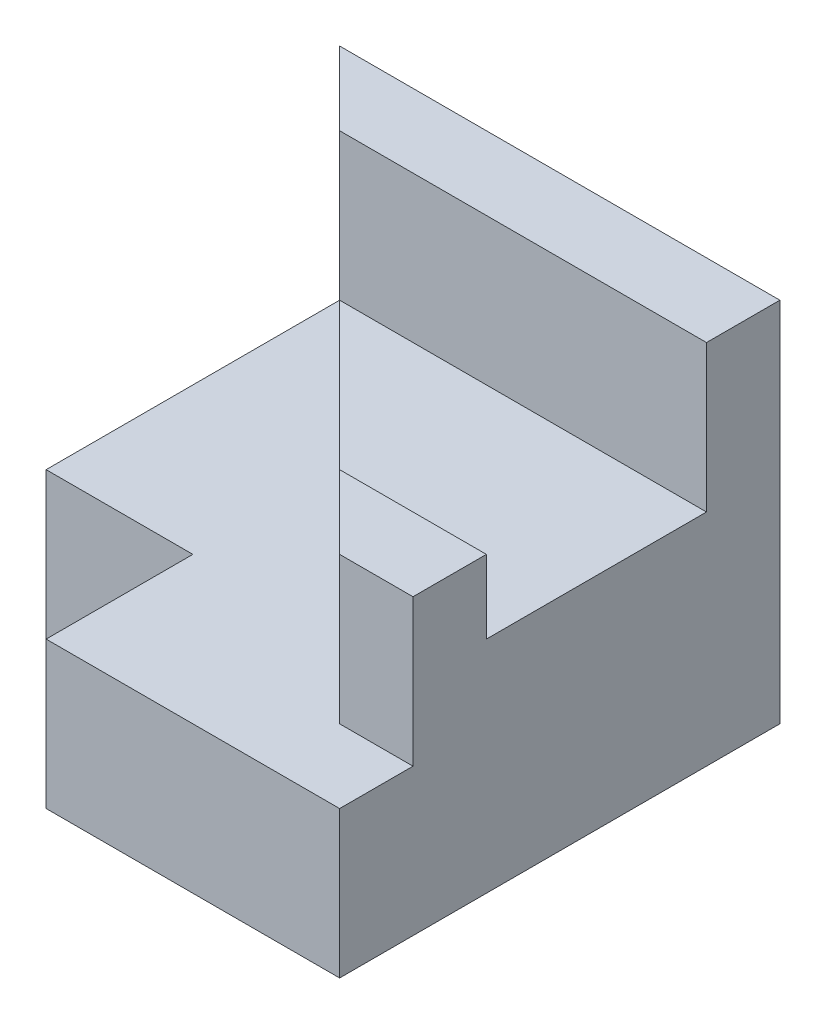
ISO-10303-21;
HEADER;
FILE_DESCRIPTION(('STEP AP214'),'2;1');
FILE_NAME('part.step','',(''),(''),'','','');
FILE_SCHEMA(('AUTOMOTIVE_DESIGN { 1 0 10303 214 1 1 1 1 }'));
ENDSEC;
DATA;
#1=APPLICATION_CONTEXT('core data for automotive mechanical design processes');
#2=APPLICATION_PROTOCOL_DEFINITION('international standard','automotive_design',2000,#1);
#3=PRODUCT_CONTEXT('',#1,'mechanical');
#4=PRODUCT('Part','Part','',(#3));
#5=PRODUCT_RELATED_PRODUCT_CATEGORY('part','',(#4));
#6=PRODUCT_DEFINITION_FORMATION('','',#4);
#7=PRODUCT_DEFINITION_CONTEXT('part definition',#1,'design');
#8=PRODUCT_DEFINITION('design','',#6,#7);
#9=PRODUCT_DEFINITION_SHAPE('','',#8);
#10=(LENGTH_UNIT() NAMED_UNIT(*) SI_UNIT(.MILLI.,.METRE.));
#11=(NAMED_UNIT(*) PLANE_ANGLE_UNIT() SI_UNIT($,.RADIAN.));
#12=(NAMED_UNIT(*) SI_UNIT($,.STERADIAN.) SOLID_ANGLE_UNIT());
#13=UNCERTAINTY_MEASURE_WITH_UNIT(LENGTH_MEASURE(1.E-05),#10,'distance_accuracy_value','');
#14=(GEOMETRIC_REPRESENTATION_CONTEXT(3) GLOBAL_UNCERTAINTY_ASSIGNED_CONTEXT((#13)) GLOBAL_UNIT_ASSIGNED_CONTEXT((#10,
#11,#12)) REPRESENTATION_CONTEXT('',''));
#15=CARTESIAN_POINT('',(0.,0.,0.));
#16=DIRECTION('',(0.,0.,1.));
#17=DIRECTION('',(1.,0.,0.));
#18=AXIS2_PLACEMENT_3D('',#15,#16,#17);
#19=CARTESIAN_POINT('',(0.,-20.,120.));
#20=DIRECTION('',(0.,-1.,0.));
#21=DIRECTION('',(1.,0.,0.));
#22=AXIS2_PLACEMENT_3D('',#19,#20,#21);
#23=PLANE('',#22);
#24=DIRECTION('',(0.707106781186547,0.,0.707106781186548));
#25=VECTOR('',#24,1.);
#26=CARTESIAN_POINT('',(0.,-20.,0.));
#27=LINE('',#26,#25);
#28=CARTESIAN_POINT('',(-120.,-20.,-120.));
#29=VERTEX_POINT('',#28);
#30=CARTESIAN_POINT('',(79.9999999999999,-20.,80.));
#31=VERTEX_POINT('',#30);
#32=EDGE_CURVE('E139',#29,#31,#27,.T.);
#33=ORIENTED_EDGE('',*,*,#32,.F.);
#34=DIRECTION('',(0.,0.,-1.));
#35=VECTOR('',#34,1.);
#36=CARTESIAN_POINT('',(-120.,-20.,40.));
#37=LINE('',#36,#35);
#38=CARTESIAN_POINT('',(-120.,-20.,40.));
#39=VERTEX_POINT('',#38);
#40=EDGE_CURVE('E227',#39,#29,#37,.T.);
#41=ORIENTED_EDGE('',*,*,#40,.F.);
#42=DIRECTION('',(-1.,0.,0.));
#43=VECTOR('',#42,1.);
#44=CARTESIAN_POINT('',(0.,-20.,40.));
#45=LINE('',#44,#43);
#46=CARTESIAN_POINT('',(-40.0000000000001,-20.,40.));
#47=VERTEX_POINT('',#46);
#48=EDGE_CURVE('E201',#47,#39,#45,.T.);
#49=ORIENTED_EDGE('',*,*,#48,.F.);
#50=DIRECTION('',(0.,0.,-1.));
#51=VECTOR('',#50,1.);
#52=CARTESIAN_POINT('',(-40.0000000000001,-20.,120.));
#53=LINE('',#52,#51);
#54=CARTESIAN_POINT('',(-40.0000000000001,-20.,120.));
#55=VERTEX_POINT('',#54);
#56=EDGE_CURVE('E11',#55,#47,#53,.T.);
#57=ORIENTED_EDGE('',*,*,#56,.F.);
#58=DIRECTION('',(-1.,0.,0.));
#59=VECTOR('',#58,1.);
#60=CARTESIAN_POINT('',(0.,-20.,120.));
#61=LINE('',#60,#59);
#62=CARTESIAN_POINT('',(120.,-20.,120.));
#63=VERTEX_POINT('',#62);
#64=EDGE_CURVE('E269',#63,#55,#61,.T.);
#65=ORIENTED_EDGE('',*,*,#64,.F.);
#66=DIRECTION('',(0.,0.,-1.));
#67=VECTOR('',#66,1.);
#68=CARTESIAN_POINT('',(120.,-20.,120.));
#69=LINE('',#68,#67);
#70=CARTESIAN_POINT('',(120.,-20.,80.));
#71=VERTEX_POINT('',#70);
#72=EDGE_CURVE('E207',#63,#71,#69,.T.);
#73=ORIENTED_EDGE('',*,*,#72,.T.);
#74=DIRECTION('',(-1.,0.,0.));
#75=VECTOR('',#74,1.);
#76=CARTESIAN_POINT('',(0.,-20.,80.));
#77=LINE('',#76,#75);
#78=EDGE_CURVE('E39',#71,#31,#77,.T.);
#79=ORIENTED_EDGE('',*,*,#78,.T.);
#80=EDGE_LOOP('',(#33,#41,#49,#57,#65,#73,#79));
#81=FACE_BOUND('',#80,.T.);
#82=ADVANCED_FACE('F36',(#81),#23,.F.);
#83=CARTESIAN_POINT('',(-40.0000000000001,0.,120.));
#84=DIRECTION('',(1.,0.,0.));
#85=DIRECTION('',(0.,1.,0.));
#86=AXIS2_PLACEMENT_3D('',#83,#84,#85);
#87=PLANE('',#86);
#88=ORIENTED_EDGE('',*,*,#56,.T.);
#89=DIRECTION('',(0.,-1.,0.));
#90=VECTOR('',#89,1.);
#91=CARTESIAN_POINT('',(-40.0000000000001,0.,40.));
#92=LINE('',#91,#90);
#93=CARTESIAN_POINT('',(-40.0000000000001,-100.,40.));
#94=VERTEX_POINT('',#93);
#95=EDGE_CURVE('E192',#47,#94,#92,.T.);
#96=ORIENTED_EDGE('',*,*,#95,.T.);
#97=DIRECTION('',(0.,0.,-1.));
#98=VECTOR('',#97,1.);
#99=CARTESIAN_POINT('',(-40.0000000000001,-100.,120.));
#100=LINE('',#99,#98);
#101=CARTESIAN_POINT('',(-40.0000000000001,-100.,120.));
#102=VERTEX_POINT('',#101);
#103=EDGE_CURVE('E45',#102,#94,#100,.T.);
#104=ORIENTED_EDGE('',*,*,#103,.F.);
#105=DIRECTION('',(0.,-1.,0.));
#106=VECTOR('',#105,1.);
#107=CARTESIAN_POINT('',(-40.0000000000001,0.,120.));
#108=LINE('',#107,#106);
#109=EDGE_CURVE('E276',#55,#102,#108,.T.);
#110=ORIENTED_EDGE('',*,*,#109,.F.);
#111=EDGE_LOOP('',(#88,#96,#104,#110));
#112=FACE_BOUND('',#111,.T.);
#113=ADVANCED_FACE('F282',(#112),#87,.F.);
#114=CARTESIAN_POINT('',(0.,-100.,120.));
#115=DIRECTION('',(0.,-1.,0.));
#116=DIRECTION('',(1.,0.,0.));
#117=AXIS2_PLACEMENT_3D('',#114,#115,#116);
#118=PLANE('',#117);
#119=DIRECTION('',(0.,0.,-1.));
#120=VECTOR('',#119,1.);
#121=CARTESIAN_POINT('',(-120.,-100.,40.));
#122=LINE('',#121,#120);
#123=CARTESIAN_POINT('',(-120.,-100.,40.));
#124=VERTEX_POINT('',#123);
#125=CARTESIAN_POINT('',(-120.,-100.,-120.));
#126=VERTEX_POINT('',#125);
#127=EDGE_CURVE('E225',#124,#126,#122,.T.);
#128=ORIENTED_EDGE('',*,*,#127,.T.);
#129=DIRECTION('',(-1.,0.,0.));
#130=VECTOR('',#129,1.);
#131=CARTESIAN_POINT('',(0.,-100.,-120.));
#132=LINE('',#131,#130);
#133=CARTESIAN_POINT('',(120.,-100.,-120.));
#134=VERTEX_POINT('',#133);
#135=EDGE_CURVE('E188',#134,#126,#132,.T.);
#136=ORIENTED_EDGE('',*,*,#135,.F.);
#137=DIRECTION('',(0.,0.,-1.));
#138=VECTOR('',#137,1.);
#139=CARTESIAN_POINT('',(120.,-100.,120.));
#140=LINE('',#139,#138);
#141=CARTESIAN_POINT('',(120.,-100.,120.));
#142=VERTEX_POINT('',#141);
#143=EDGE_CURVE('E210',#142,#134,#140,.T.);
#144=ORIENTED_EDGE('',*,*,#143,.F.);
#145=DIRECTION('',(-1.,0.,0.));
#146=VECTOR('',#145,1.);
#147=CARTESIAN_POINT('',(0.,-100.,120.));
#148=LINE('',#147,#146);
#149=EDGE_CURVE('E274',#142,#102,#148,.T.);
#150=ORIENTED_EDGE('',*,*,#149,.T.);
#151=ORIENTED_EDGE('',*,*,#103,.T.);
#152=DIRECTION('',(-1.,0.,0.));
#153=VECTOR('',#152,1.);
#154=CARTESIAN_POINT('',(0.,-100.,40.));
#155=LINE('',#154,#153);
#156=EDGE_CURVE('E223',#94,#124,#155,.T.);
#157=ORIENTED_EDGE('',*,*,#156,.T.);
#158=EDGE_LOOP('',(#128,#136,#144,#150,#151,#157));
#159=FACE_BOUND('',#158,.T.);
#160=ADVANCED_FACE('F239',(#159),#118,.T.);
#161=CARTESIAN_POINT('',(120.,0.,120.));
#162=DIRECTION('',(1.,0.,0.));
#163=DIRECTION('',(0.,1.,0.));
#164=AXIS2_PLACEMENT_3D('',#161,#162,#163);
#165=PLANE('',#164);
#166=ORIENTED_EDGE('',*,*,#143,.T.);
#167=DIRECTION('',(0.,-1.,0.));
#168=VECTOR('',#167,1.);
#169=CARTESIAN_POINT('',(120.,0.,-120.));
#170=LINE('',#169,#168);
#171=CARTESIAN_POINT('',(120.,100.,-120.));
#172=VERTEX_POINT('',#171);
#173=EDGE_CURVE('E146',#172,#134,#170,.T.);
#174=ORIENTED_EDGE('',*,*,#173,.F.);
#175=DIRECTION('',(0.,0.,-1.));
#176=VECTOR('',#175,1.);
#177=CARTESIAN_POINT('',(120.,100.,0.));
#178=LINE('',#177,#176);
#179=CARTESIAN_POINT('',(120.,100.,-80.));
#180=VERTEX_POINT('',#179);
#181=EDGE_CURVE('E143',#180,#172,#178,.T.);
#182=ORIENTED_EDGE('',*,*,#181,.F.);
#183=DIRECTION('',(0.,-1.,0.));
#184=VECTOR('',#183,1.);
#185=CARTESIAN_POINT('',(120.,100.,-80.));
#186=LINE('',#185,#184);
#187=CARTESIAN_POINT('',(120.,20.,-80.));
#188=VERTEX_POINT('',#187);
#189=EDGE_CURVE('E130',#180,#188,#186,.T.);
#190=ORIENTED_EDGE('',*,*,#189,.T.);
#191=DIRECTION('',(0.,0.,-1.));
#192=VECTOR('',#191,1.);
#193=CARTESIAN_POINT('',(120.,20.,0.));
#194=LINE('',#193,#192);
#195=CARTESIAN_POINT('',(120.,20.,40.));
#196=VERTEX_POINT('',#195);
#197=EDGE_CURVE('E249',#196,#188,#194,.T.);
#198=ORIENTED_EDGE('',*,*,#197,.F.);
#199=DIRECTION('',(0.,-1.,0.));
#200=VECTOR('',#199,1.);
#201=CARTESIAN_POINT('',(120.,60.,40.));
#202=LINE('',#201,#200);
#203=CARTESIAN_POINT('',(120.,60.,40.));
#204=VERTEX_POINT('',#203);
#205=EDGE_CURVE('E53',#204,#196,#202,.T.);
#206=ORIENTED_EDGE('',*,*,#205,.F.);
#207=DIRECTION('',(0.,0.,-1.));
#208=VECTOR('',#207,1.);
#209=CARTESIAN_POINT('',(120.,60.,0.));
#210=LINE('',#209,#208);
#211=CARTESIAN_POINT('',(120.,60.,80.));
#212=VERTEX_POINT('',#211);
#213=EDGE_CURVE('E166',#212,#204,#210,.T.);
#214=ORIENTED_EDGE('',*,*,#213,.F.);
#215=DIRECTION('',(0.,-1.,0.));
#216=VECTOR('',#215,1.);
#217=CARTESIAN_POINT('',(120.,60.,80.));
#218=LINE('',#217,#216);
#219=EDGE_CURVE('E176',#212,#71,#218,.T.);
#220=ORIENTED_EDGE('',*,*,#219,.T.);
#221=ORIENTED_EDGE('',*,*,#72,.F.);
#222=DIRECTION('',(0.,-1.,0.));
#223=VECTOR('',#222,1.);
#224=CARTESIAN_POINT('',(120.,0.,120.));
#225=LINE('',#224,#223);
#226=EDGE_CURVE('E211',#63,#142,#225,.T.);
#227=ORIENTED_EDGE('',*,*,#226,.T.);
#228=EDGE_LOOP('',(#166,#174,#182,#190,#198,#206,#214,#220,#221,#227));
#229=FACE_BOUND('',#228,.T.);
#230=ADVANCED_FACE('F144',(#229),#165,.T.);
#231=CARTESIAN_POINT('',(0.,0.,120.));
#232=DIRECTION('',(0.,0.,1.));
#233=DIRECTION('',(1.,0.,0.));
#234=AXIS2_PLACEMENT_3D('',#231,#232,#233);
#235=PLANE('',#234);
#236=ORIENTED_EDGE('',*,*,#64,.T.);
#237=ORIENTED_EDGE('',*,*,#109,.T.);
#238=ORIENTED_EDGE('',*,*,#149,.F.);
#239=ORIENTED_EDGE('',*,*,#226,.F.);
#240=EDGE_LOOP('',(#236,#237,#238,#239));
#241=FACE_BOUND('',#240,.T.);
#242=ADVANCED_FACE('F283',(#241),#235,.T.);
#243=CARTESIAN_POINT('',(-120.,0.,40.));
#244=DIRECTION('',(1.,0.,0.));
#245=DIRECTION('',(0.,1.,0.));
#246=AXIS2_PLACEMENT_3D('',#243,#244,#245);
#247=PLANE('',#246);
#248=ORIENTED_EDGE('',*,*,#40,.T.);
#249=DIRECTION('',(0.,-1.,0.));
#250=VECTOR('',#249,1.);
#251=CARTESIAN_POINT('',(-120.,0.,-120.));
#252=LINE('',#251,#250);
#253=EDGE_CURVE('E185',#29,#126,#252,.T.);
#254=ORIENTED_EDGE('',*,*,#253,.T.);
#255=ORIENTED_EDGE('',*,*,#127,.F.);
#256=DIRECTION('',(0.,-1.,0.));
#257=VECTOR('',#256,1.);
#258=CARTESIAN_POINT('',(-120.,0.,40.));
#259=LINE('',#258,#257);
#260=EDGE_CURVE('E195',#39,#124,#259,.T.);
#261=ORIENTED_EDGE('',*,*,#260,.F.);
#262=EDGE_LOOP('',(#248,#254,#255,#261));
#263=FACE_BOUND('',#262,.T.);
#264=ADVANCED_FACE('F236',(#263),#247,.F.);
#265=CARTESIAN_POINT('',(0.,0.,40.));
#266=DIRECTION('',(0.,0.,1.));
#267=DIRECTION('',(1.,0.,0.));
#268=AXIS2_PLACEMENT_3D('',#265,#266,#267);
#269=PLANE('',#268);
#270=ORIENTED_EDGE('',*,*,#95,.F.);
#271=ORIENTED_EDGE('',*,*,#48,.T.);
#272=ORIENTED_EDGE('',*,*,#260,.T.);
#273=ORIENTED_EDGE('',*,*,#156,.F.);
#274=EDGE_LOOP('',(#270,#271,#272,#273));
#275=FACE_BOUND('',#274,.T.);
#276=ADVANCED_FACE('F232',(#275),#269,.T.);
#277=CARTESIAN_POINT('',(0.,0.,-120.));
#278=DIRECTION('',(0.,0.,1.));
#279=DIRECTION('',(1.,0.,0.));
#280=AXIS2_PLACEMENT_3D('',#277,#278,#279);
#281=PLANE('',#280);
#282=ORIENTED_EDGE('',*,*,#253,.F.);
#283=DIRECTION('',(0.,-1.,0.));
#284=VECTOR('',#283,1.);
#285=CARTESIAN_POINT('',(-120.,100.,-120.));
#286=LINE('',#285,#284);
#287=CARTESIAN_POINT('',(-120.,100.,-120.));
#288=VERTEX_POINT('',#287);
#289=EDGE_CURVE('E140',#288,#29,#286,.T.);
#290=ORIENTED_EDGE('',*,*,#289,.F.);
#291=DIRECTION('',(-1.,0.,0.));
#292=VECTOR('',#291,1.);
#293=CARTESIAN_POINT('',(0.,100.,-120.));
#294=LINE('',#293,#292);
#295=EDGE_CURVE('E149',#172,#288,#294,.T.);
#296=ORIENTED_EDGE('',*,*,#295,.F.);
#297=ORIENTED_EDGE('',*,*,#173,.T.);
#298=ORIENTED_EDGE('',*,*,#135,.T.);
#299=EDGE_LOOP('',(#282,#290,#296,#297,#298));
#300=FACE_BOUND('',#299,.T.);
#301=ADVANCED_FACE('F241',(#300),#281,.F.);
#302=CARTESIAN_POINT('',(0.,60.,40.));
#303=DIRECTION('',(0.,0.,1.));
#304=DIRECTION('',(1.,0.,0.));
#305=AXIS2_PLACEMENT_3D('',#302,#303,#304);
#306=PLANE('',#305);
#307=ORIENTED_EDGE('',*,*,#205,.T.);
#308=DIRECTION('',(-1.,0.,0.));
#309=VECTOR('',#308,1.);
#310=CARTESIAN_POINT('',(0.,20.,40.));
#311=LINE('',#310,#309);
#312=CARTESIAN_POINT('',(39.9999999999999,20.,40.));
#313=VERTEX_POINT('',#312);
#314=EDGE_CURVE('E58',#196,#313,#311,.T.);
#315=ORIENTED_EDGE('',*,*,#314,.T.);
#316=DIRECTION('',(0.,-1.,0.));
#317=VECTOR('',#316,1.);
#318=CARTESIAN_POINT('',(39.9999999999999,60.,40.));
#319=LINE('',#318,#317);
#320=CARTESIAN_POINT('',(39.9999999999999,60.,40.));
#321=VERTEX_POINT('',#320);
#322=EDGE_CURVE('E183',#321,#313,#319,.T.);
#323=ORIENTED_EDGE('',*,*,#322,.F.);
#324=DIRECTION('',(-1.,0.,0.));
#325=VECTOR('',#324,1.);
#326=CARTESIAN_POINT('',(0.,60.,40.));
#327=LINE('',#326,#325);
#328=EDGE_CURVE('E169',#204,#321,#327,.T.);
#329=ORIENTED_EDGE('',*,*,#328,.F.);
#330=EDGE_LOOP('',(#307,#315,#323,#329));
#331=FACE_BOUND('',#330,.T.);
#332=ADVANCED_FACE('F334',(#331),#306,.F.);
#333=CARTESIAN_POINT('',(0.,60.,0.));
#334=DIRECTION('',(0.707106781186548,0.,-0.707106781186547));
#335=DIRECTION('',(-0.707106781186547,0.,-0.707106781186548));
#336=AXIS2_PLACEMENT_3D('',#333,#334,#335);
#337=PLANE('',#336);
#338=ORIENTED_EDGE('',*,*,#32,.T.);
#339=DIRECTION('',(0.,-1.,0.));
#340=VECTOR('',#339,1.);
#341=CARTESIAN_POINT('',(79.9999999999999,60.,80.));
#342=LINE('',#341,#340);
#343=CARTESIAN_POINT('',(79.9999999999999,60.,80.));
#344=VERTEX_POINT('',#343);
#345=EDGE_CURVE('E180',#344,#31,#342,.T.);
#346=ORIENTED_EDGE('',*,*,#345,.F.);
#347=DIRECTION('',(0.707106781186547,0.,0.707106781186548));
#348=VECTOR('',#347,1.);
#349=CARTESIAN_POINT('',(0.,60.,0.));
#350=LINE('',#349,#348);
#351=EDGE_CURVE('E171',#321,#344,#350,.T.);
#352=ORIENTED_EDGE('',*,*,#351,.F.);
#353=ORIENTED_EDGE('',*,*,#322,.T.);
#354=DIRECTION('',(0.707106781186547,0.,0.707106781186548));
#355=VECTOR('',#354,1.);
#356=CARTESIAN_POINT('',(0.,20.,0.));
#357=LINE('',#356,#355);
#358=CARTESIAN_POINT('',(-80.0000000000001,20.,-80.));
#359=VERTEX_POINT('',#358);
#360=EDGE_CURVE('E156',#359,#313,#357,.T.);
#361=ORIENTED_EDGE('',*,*,#360,.F.);
#362=DIRECTION('',(0.,-1.,0.));
#363=VECTOR('',#362,1.);
#364=CARTESIAN_POINT('',(-80.0000000000001,100.,-80.));
#365=LINE('',#364,#363);
#366=CARTESIAN_POINT('',(-80.0000000000001,100.,-80.));
#367=VERTEX_POINT('',#366);
#368=EDGE_CURVE('E162',#367,#359,#365,.T.);
#369=ORIENTED_EDGE('',*,*,#368,.F.);
#370=DIRECTION('',(0.707106781186547,0.,0.707106781186548));
#371=VECTOR('',#370,1.);
#372=CARTESIAN_POINT('',(0.,100.,0.));
#373=LINE('',#372,#371);
#374=EDGE_CURVE('E153',#288,#367,#373,.T.);
#375=ORIENTED_EDGE('',*,*,#374,.F.);
#376=ORIENTED_EDGE('',*,*,#289,.T.);
#377=EDGE_LOOP('',(#338,#346,#352,#353,#361,#369,#375,#376));
#378=FACE_BOUND('',#377,.T.);
#379=ADVANCED_FACE('F244',(#378),#337,.F.);
#380=CARTESIAN_POINT('',(0.,60.,80.));
#381=DIRECTION('',(0.,0.,1.));
#382=DIRECTION('',(1.,0.,0.));
#383=AXIS2_PLACEMENT_3D('',#380,#381,#382);
#384=PLANE('',#383);
#385=ORIENTED_EDGE('',*,*,#78,.F.);
#386=ORIENTED_EDGE('',*,*,#219,.F.);
#387=DIRECTION('',(-1.,0.,0.));
#388=VECTOR('',#387,1.);
#389=CARTESIAN_POINT('',(0.,60.,80.));
#390=LINE('',#389,#388);
#391=EDGE_CURVE('E173',#212,#344,#390,.T.);
#392=ORIENTED_EDGE('',*,*,#391,.T.);
#393=ORIENTED_EDGE('',*,*,#345,.T.);
#394=EDGE_LOOP('',(#385,#386,#392,#393));
#395=FACE_BOUND('',#394,.T.);
#396=ADVANCED_FACE('F261',(#395),#384,.T.);
#397=CARTESIAN_POINT('',(0.,60.,0.));
#398=DIRECTION('',(0.,1.,0.));
#399=DIRECTION('',(-1.,0.,0.));
#400=AXIS2_PLACEMENT_3D('',#397,#398,#399);
#401=PLANE('',#400);
#402=ORIENTED_EDGE('',*,*,#213,.T.);
#403=ORIENTED_EDGE('',*,*,#328,.T.);
#404=ORIENTED_EDGE('',*,*,#351,.T.);
#405=ORIENTED_EDGE('',*,*,#391,.F.);
#406=EDGE_LOOP('',(#402,#403,#404,#405));
#407=FACE_BOUND('',#406,.T.);
#408=ADVANCED_FACE('F257',(#407),#401,.T.);
#409=CARTESIAN_POINT('',(0.,100.,-80.));
#410=DIRECTION('',(0.,0.,1.));
#411=DIRECTION('',(1.,0.,0.));
#412=AXIS2_PLACEMENT_3D('',#409,#410,#411);
#413=PLANE('',#412);
#414=DIRECTION('',(-1.,0.,0.));
#415=VECTOR('',#414,1.);
#416=CARTESIAN_POINT('',(0.,20.,-80.));
#417=LINE('',#416,#415);
#418=EDGE_CURVE('E136',#188,#359,#417,.T.);
#419=ORIENTED_EDGE('',*,*,#418,.F.);
#420=ORIENTED_EDGE('',*,*,#189,.F.);
#421=DIRECTION('',(-1.,0.,0.));
#422=VECTOR('',#421,1.);
#423=CARTESIAN_POINT('',(0.,100.,-80.));
#424=LINE('',#423,#422);
#425=EDGE_CURVE('E134',#180,#367,#424,.T.);
#426=ORIENTED_EDGE('',*,*,#425,.T.);
#427=ORIENTED_EDGE('',*,*,#368,.T.);
#428=EDGE_LOOP('',(#419,#420,#426,#427));
#429=FACE_BOUND('',#428,.T.);
#430=ADVANCED_FACE('F132',(#429),#413,.T.);
#431=CARTESIAN_POINT('',(0.,100.,0.));
#432=DIRECTION('',(0.,1.,0.));
#433=DIRECTION('',(-1.,0.,0.));
#434=AXIS2_PLACEMENT_3D('',#431,#432,#433);
#435=PLANE('',#434);
#436=ORIENTED_EDGE('',*,*,#425,.F.);
#437=ORIENTED_EDGE('',*,*,#181,.T.);
#438=ORIENTED_EDGE('',*,*,#295,.T.);
#439=ORIENTED_EDGE('',*,*,#374,.T.);
#440=EDGE_LOOP('',(#436,#437,#438,#439));
#441=FACE_BOUND('',#440,.T.);
#442=ADVANCED_FACE('F151',(#441),#435,.T.);
#443=CARTESIAN_POINT('',(0.,20.,0.));
#444=DIRECTION('',(0.,1.,0.));
#445=DIRECTION('',(-1.,0.,0.));
#446=AXIS2_PLACEMENT_3D('',#443,#444,#445);
#447=PLANE('',#446);
#448=ORIENTED_EDGE('',*,*,#197,.T.);
#449=ORIENTED_EDGE('',*,*,#418,.T.);
#450=ORIENTED_EDGE('',*,*,#360,.T.);
#451=ORIENTED_EDGE('',*,*,#314,.F.);
#452=EDGE_LOOP('',(#448,#449,#450,#451));
#453=FACE_BOUND('',#452,.T.);
#454=ADVANCED_FACE('F248',(#453),#447,.T.);
#455=CLOSED_SHELL('',(#82,#113,#160,#230,#242,#264,#276,#301,#332,#379,#396,#408,#430,#442,#454));
#456=MANIFOLD_SOLID_BREP('B2',#455);
#457=ADVANCED_BREP_SHAPE_REPRESENTATION('',(#18,#456),#14);
#458=SHAPE_DEFINITION_REPRESENTATION(#9,#457);
ENDSEC;
END-ISO-10303-21;
